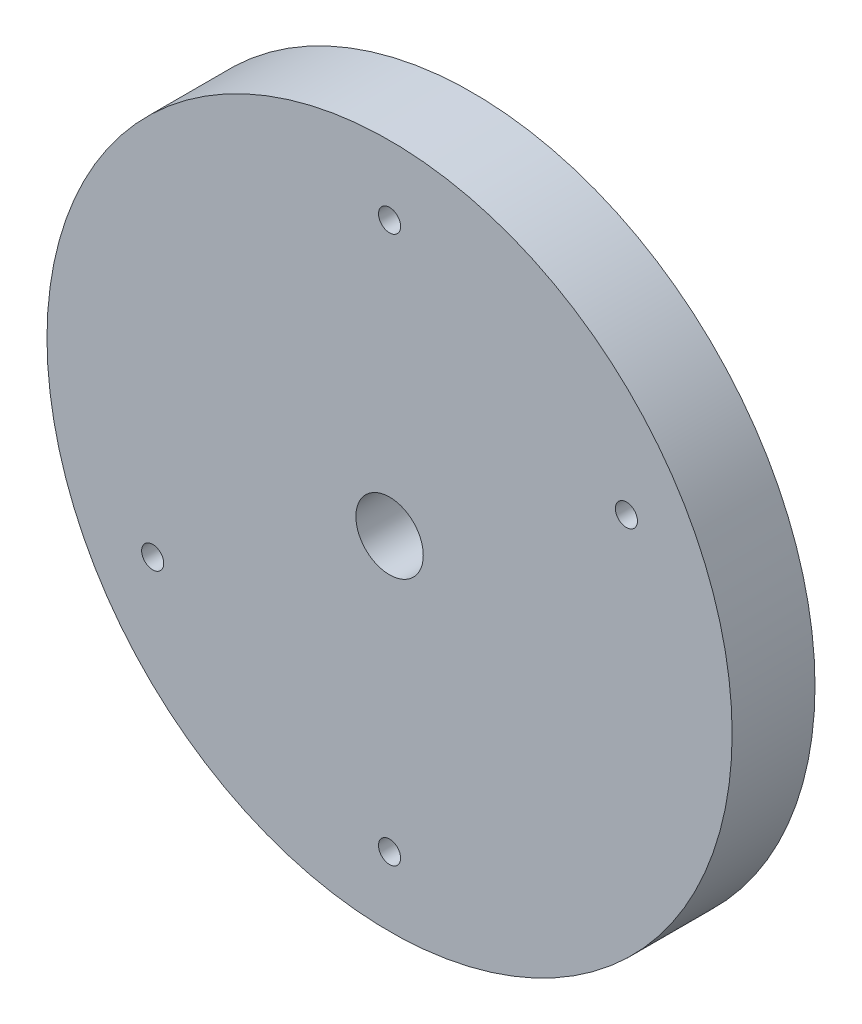
ISO-10303-21;
HEADER;
FILE_DESCRIPTION(('STEP AP214'),'2;1');
FILE_NAME('part.step','',(''),(''),'','','');
FILE_SCHEMA(('AUTOMOTIVE_DESIGN { 1 0 10303 214 1 1 1 1 }'));
ENDSEC;
DATA;
#1=APPLICATION_CONTEXT('core data for automotive mechanical design processes');
#2=APPLICATION_PROTOCOL_DEFINITION('international standard','automotive_design',2000,#1);
#3=PRODUCT_CONTEXT('',#1,'mechanical');
#4=PRODUCT('Part','Part','',(#3));
#5=PRODUCT_RELATED_PRODUCT_CATEGORY('part','',(#4));
#6=PRODUCT_DEFINITION_FORMATION('','',#4);
#7=PRODUCT_DEFINITION_CONTEXT('part definition',#1,'design');
#8=PRODUCT_DEFINITION('design','',#6,#7);
#9=PRODUCT_DEFINITION_SHAPE('','',#8);
#10=(LENGTH_UNIT() NAMED_UNIT(*) SI_UNIT(.MILLI.,.METRE.));
#11=(NAMED_UNIT(*) PLANE_ANGLE_UNIT() SI_UNIT($,.RADIAN.));
#12=(NAMED_UNIT(*) SI_UNIT($,.STERADIAN.) SOLID_ANGLE_UNIT());
#13=UNCERTAINTY_MEASURE_WITH_UNIT(LENGTH_MEASURE(1.E-05),#10,'distance_accuracy_value','');
#14=(GEOMETRIC_REPRESENTATION_CONTEXT(3) GLOBAL_UNCERTAINTY_ASSIGNED_CONTEXT((#13)) GLOBAL_UNIT_ASSIGNED_CONTEXT((#10,
#11,#12)) REPRESENTATION_CONTEXT('',''));
#15=CARTESIAN_POINT('',(0.,0.,0.));
#16=DIRECTION('',(0.,0.,1.));
#17=DIRECTION('',(1.,0.,0.));
#18=AXIS2_PLACEMENT_3D('',#15,#16,#17);
#19=CARTESIAN_POINT('',(0.,0.,15.));
#20=DIRECTION('',(0.,0.,-1.));
#21=DIRECTION('',(-1.,0.,0.));
#22=AXIS2_PLACEMENT_3D('',#19,#20,#21);
#23=CYLINDRICAL_SURFACE('',#22,62.);
#24=CARTESIAN_POINT('',(0.,0.,15.));
#25=DIRECTION('',(0.,0.,1.));
#26=DIRECTION('',(1.,0.,0.));
#27=AXIS2_PLACEMENT_3D('',#24,#25,#26);
#28=CIRCLE('',#27,62.);
#29=CARTESIAN_POINT('',(62.,0.,15.));
#30=VERTEX_POINT('',#29);
#31=EDGE_CURVE('E10',#30,#30,#28,.T.);
#32=ORIENTED_EDGE('',*,*,#31,.F.);
#33=EDGE_LOOP('',(#32));
#34=FACE_BOUND('',#33,.T.);
#35=CARTESIAN_POINT('',(0.,0.,0.));
#36=DIRECTION('',(0.,0.,1.));
#37=DIRECTION('',(1.,0.,0.));
#38=AXIS2_PLACEMENT_3D('',#35,#36,#37);
#39=CIRCLE('',#38,62.);
#40=CARTESIAN_POINT('',(62.,0.,0.));
#41=VERTEX_POINT('',#40);
#42=EDGE_CURVE('E38',#41,#41,#39,.T.);
#43=ORIENTED_EDGE('',*,*,#42,.T.);
#44=EDGE_LOOP('',(#43));
#45=FACE_BOUND('',#44,.T.);
#46=ADVANCED_FACE('F35',(#34,#45),#23,.T.);
#47=CARTESIAN_POINT('',(0.,0.,15.));
#48=DIRECTION('',(0.,0.,1.));
#49=DIRECTION('',(1.,0.,0.));
#50=AXIS2_PLACEMENT_3D('',#47,#48,#49);
#51=PLANE('',#50);
#52=CARTESIAN_POINT('',(0.,0.,15.));
#53=DIRECTION('',(0.,0.,1.));
#54=DIRECTION('',(1.,0.,0.));
#55=AXIS2_PLACEMENT_3D('',#52,#53,#54);
#56=CIRCLE('',#55,6.1);
#57=CARTESIAN_POINT('',(6.1,0.,15.));
#58=VERTEX_POINT('',#57);
#59=EDGE_CURVE('E71',#58,#58,#56,.T.);
#60=ORIENTED_EDGE('',*,*,#59,.F.);
#61=EDGE_LOOP('',(#60));
#62=FACE_BOUND('',#61,.T.);
#63=CARTESIAN_POINT('',(-42.8682574873298,-24.7499999999999,15.));
#64=DIRECTION('',(0.,0.,1.));
#65=DIRECTION('',(-0.499999999999998,0.86602540378444,0.));
#66=AXIS2_PLACEMENT_3D('',#63,#64,#65);
#67=CIRCLE('',#66,2.);
#68=CARTESIAN_POINT('',(-43.8682574873298,-23.017949192431,15.));
#69=VERTEX_POINT('',#68);
#70=EDGE_CURVE('E65',#69,#69,#67,.T.);
#71=ORIENTED_EDGE('',*,*,#70,.F.);
#72=EDGE_LOOP('',(#71));
#73=FACE_BOUND('',#72,.T.);
#74=CARTESIAN_POINT('',(0.,-49.5,15.));
#75=DIRECTION('',(0.,0.,1.));
#76=DIRECTION('',(-1.,0.,0.));
#77=AXIS2_PLACEMENT_3D('',#74,#75,#76);
#78=CIRCLE('',#77,2.);
#79=CARTESIAN_POINT('',(-2.,-49.5,15.));
#80=VERTEX_POINT('',#79);
#81=EDGE_CURVE('E59',#80,#80,#78,.T.);
#82=ORIENTED_EDGE('',*,*,#81,.F.);
#83=EDGE_LOOP('',(#82));
#84=FACE_BOUND('',#83,.T.);
#85=CARTESIAN_POINT('',(42.8682574873298,24.7499999999999,15.));
#86=DIRECTION('',(0.,0.,1.));
#87=DIRECTION('',(0.499999999999998,-0.86602540378444,0.));
#88=AXIS2_PLACEMENT_3D('',#85,#86,#87);
#89=CIRCLE('',#88,2.);
#90=CARTESIAN_POINT('',(43.8682574873298,23.017949192431,15.));
#91=VERTEX_POINT('',#90);
#92=EDGE_CURVE('E53',#91,#91,#89,.T.);
#93=ORIENTED_EDGE('',*,*,#92,.F.);
#94=EDGE_LOOP('',(#93));
#95=FACE_BOUND('',#94,.T.);
#96=CARTESIAN_POINT('',(0.,49.5,15.));
#97=DIRECTION('',(0.,0.,1.));
#98=DIRECTION('',(1.,0.,0.));
#99=AXIS2_PLACEMENT_3D('',#96,#97,#98);
#100=CIRCLE('',#99,2.);
#101=CARTESIAN_POINT('',(2.,49.5,15.));
#102=VERTEX_POINT('',#101);
#103=EDGE_CURVE('E47',#102,#102,#100,.T.);
#104=ORIENTED_EDGE('',*,*,#103,.F.);
#105=EDGE_LOOP('',(#104));
#106=FACE_BOUND('',#105,.T.);
#107=ORIENTED_EDGE('',*,*,#31,.T.);
#108=EDGE_LOOP('',(#107));
#109=FACE_BOUND('',#108,.T.);
#110=ADVANCED_FACE('F87',(#62,#73,#84,#95,#106,#109),#51,.T.);
#111=CARTESIAN_POINT('',(0.,0.,0.));
#112=DIRECTION('',(0.,0.,1.));
#113=DIRECTION('',(1.,0.,0.));
#114=AXIS2_PLACEMENT_3D('',#111,#112,#113);
#115=PLANE('',#114);
#116=CARTESIAN_POINT('',(0.,0.,0.));
#117=DIRECTION('',(0.,0.,1.));
#118=DIRECTION('',(1.,0.,0.));
#119=AXIS2_PLACEMENT_3D('',#116,#117,#118);
#120=CIRCLE('',#119,6.1);
#121=CARTESIAN_POINT('',(6.1,0.,0.));
#122=VERTEX_POINT('',#121);
#123=EDGE_CURVE('E68',#122,#122,#120,.T.);
#124=ORIENTED_EDGE('',*,*,#123,.T.);
#125=EDGE_LOOP('',(#124));
#126=FACE_BOUND('',#125,.T.);
#127=CARTESIAN_POINT('',(-42.8682574873298,-24.7499999999999,0.));
#128=DIRECTION('',(0.,0.,1.));
#129=DIRECTION('',(-0.499999999999998,0.86602540378444,0.));
#130=AXIS2_PLACEMENT_3D('',#127,#128,#129);
#131=CIRCLE('',#130,2.);
#132=CARTESIAN_POINT('',(-43.8682574873298,-23.017949192431,0.));
#133=VERTEX_POINT('',#132);
#134=EDGE_CURVE('E62',#133,#133,#131,.T.);
#135=ORIENTED_EDGE('',*,*,#134,.T.);
#136=EDGE_LOOP('',(#135));
#137=FACE_BOUND('',#136,.T.);
#138=CARTESIAN_POINT('',(0.,-49.5,0.));
#139=DIRECTION('',(0.,0.,1.));
#140=DIRECTION('',(-1.,0.,0.));
#141=AXIS2_PLACEMENT_3D('',#138,#139,#140);
#142=CIRCLE('',#141,2.);
#143=CARTESIAN_POINT('',(-2.,-49.5,0.));
#144=VERTEX_POINT('',#143);
#145=EDGE_CURVE('E56',#144,#144,#142,.T.);
#146=ORIENTED_EDGE('',*,*,#145,.T.);
#147=EDGE_LOOP('',(#146));
#148=FACE_BOUND('',#147,.T.);
#149=CARTESIAN_POINT('',(42.8682574873298,24.7499999999999,0.));
#150=DIRECTION('',(0.,0.,1.));
#151=DIRECTION('',(0.499999999999998,-0.86602540378444,0.));
#152=AXIS2_PLACEMENT_3D('',#149,#150,#151);
#153=CIRCLE('',#152,2.);
#154=CARTESIAN_POINT('',(43.8682574873298,23.017949192431,0.));
#155=VERTEX_POINT('',#154);
#156=EDGE_CURVE('E50',#155,#155,#153,.T.);
#157=ORIENTED_EDGE('',*,*,#156,.T.);
#158=EDGE_LOOP('',(#157));
#159=FACE_BOUND('',#158,.T.);
#160=CARTESIAN_POINT('',(0.,49.5,0.));
#161=DIRECTION('',(0.,0.,1.));
#162=DIRECTION('',(1.,0.,0.));
#163=AXIS2_PLACEMENT_3D('',#160,#161,#162);
#164=CIRCLE('',#163,2.);
#165=CARTESIAN_POINT('',(2.,49.5,0.));
#166=VERTEX_POINT('',#165);
#167=EDGE_CURVE('E45',#166,#166,#164,.T.);
#168=ORIENTED_EDGE('',*,*,#167,.T.);
#169=EDGE_LOOP('',(#168));
#170=FACE_BOUND('',#169,.T.);
#171=ORIENTED_EDGE('',*,*,#42,.F.);
#172=EDGE_LOOP('',(#171));
#173=FACE_BOUND('',#172,.T.);
#174=ADVANCED_FACE('F77',(#126,#137,#148,#159,#170,#173),#115,.F.);
#175=CARTESIAN_POINT('',(0.,49.5,0.));
#176=DIRECTION('',(0.,0.,1.));
#177=DIRECTION('',(1.,0.,0.));
#178=AXIS2_PLACEMENT_3D('',#175,#176,#177);
#179=CYLINDRICAL_SURFACE('',#178,2.);
#180=ORIENTED_EDGE('',*,*,#167,.F.);
#181=EDGE_LOOP('',(#180));
#182=FACE_BOUND('',#181,.T.);
#183=ORIENTED_EDGE('',*,*,#103,.T.);
#184=EDGE_LOOP('',(#183));
#185=FACE_BOUND('',#184,.T.);
#186=ADVANCED_FACE('F99',(#182,#185),#179,.F.);
#187=CARTESIAN_POINT('',(42.8682574873298,24.7499999999999,0.));
#188=DIRECTION('',(0.,0.,1.));
#189=DIRECTION('',(1.,0.,0.));
#190=AXIS2_PLACEMENT_3D('',#187,#188,#189);
#191=CYLINDRICAL_SURFACE('',#190,2.);
#192=ORIENTED_EDGE('',*,*,#156,.F.);
#193=EDGE_LOOP('',(#192));
#194=FACE_BOUND('',#193,.T.);
#195=ORIENTED_EDGE('',*,*,#92,.T.);
#196=EDGE_LOOP('',(#195));
#197=FACE_BOUND('',#196,.T.);
#198=ADVANCED_FACE('F101',(#194,#197),#191,.F.);
#199=CARTESIAN_POINT('',(0.,-49.5,0.));
#200=DIRECTION('',(0.,0.,1.));
#201=DIRECTION('',(1.,0.,0.));
#202=AXIS2_PLACEMENT_3D('',#199,#200,#201);
#203=CYLINDRICAL_SURFACE('',#202,2.);
#204=ORIENTED_EDGE('',*,*,#145,.F.);
#205=EDGE_LOOP('',(#204));
#206=FACE_BOUND('',#205,.T.);
#207=ORIENTED_EDGE('',*,*,#81,.T.);
#208=EDGE_LOOP('',(#207));
#209=FACE_BOUND('',#208,.T.);
#210=ADVANCED_FACE('F108',(#206,#209),#203,.F.);
#211=CARTESIAN_POINT('',(-42.8682574873298,-24.7499999999999,0.));
#212=DIRECTION('',(0.,0.,1.));
#213=DIRECTION('',(1.,0.,0.));
#214=AXIS2_PLACEMENT_3D('',#211,#212,#213);
#215=CYLINDRICAL_SURFACE('',#214,2.);
#216=ORIENTED_EDGE('',*,*,#134,.F.);
#217=EDGE_LOOP('',(#216));
#218=FACE_BOUND('',#217,.T.);
#219=ORIENTED_EDGE('',*,*,#70,.T.);
#220=EDGE_LOOP('',(#219));
#221=FACE_BOUND('',#220,.T.);
#222=ADVANCED_FACE('F83',(#218,#221),#215,.F.);
#223=CARTESIAN_POINT('',(0.,0.,0.));
#224=DIRECTION('',(0.,0.,1.));
#225=DIRECTION('',(1.,0.,0.));
#226=AXIS2_PLACEMENT_3D('',#223,#224,#225);
#227=CYLINDRICAL_SURFACE('',#226,6.1);
#228=ORIENTED_EDGE('',*,*,#123,.F.);
#229=EDGE_LOOP('',(#228));
#230=FACE_BOUND('',#229,.T.);
#231=ORIENTED_EDGE('',*,*,#59,.T.);
#232=EDGE_LOOP('',(#231));
#233=FACE_BOUND('',#232,.T.);
#234=ADVANCED_FACE('F80',(#230,#233),#227,.F.);
#235=CLOSED_SHELL('',(#46,#110,#174,#186,#198,#210,#222,#234));
#236=MANIFOLD_SOLID_BREP('B2',#235);
#237=ADVANCED_BREP_SHAPE_REPRESENTATION('',(#18,#236),#14);
#238=SHAPE_DEFINITION_REPRESENTATION(#9,#237);
ENDSEC;
END-ISO-10303-21;
